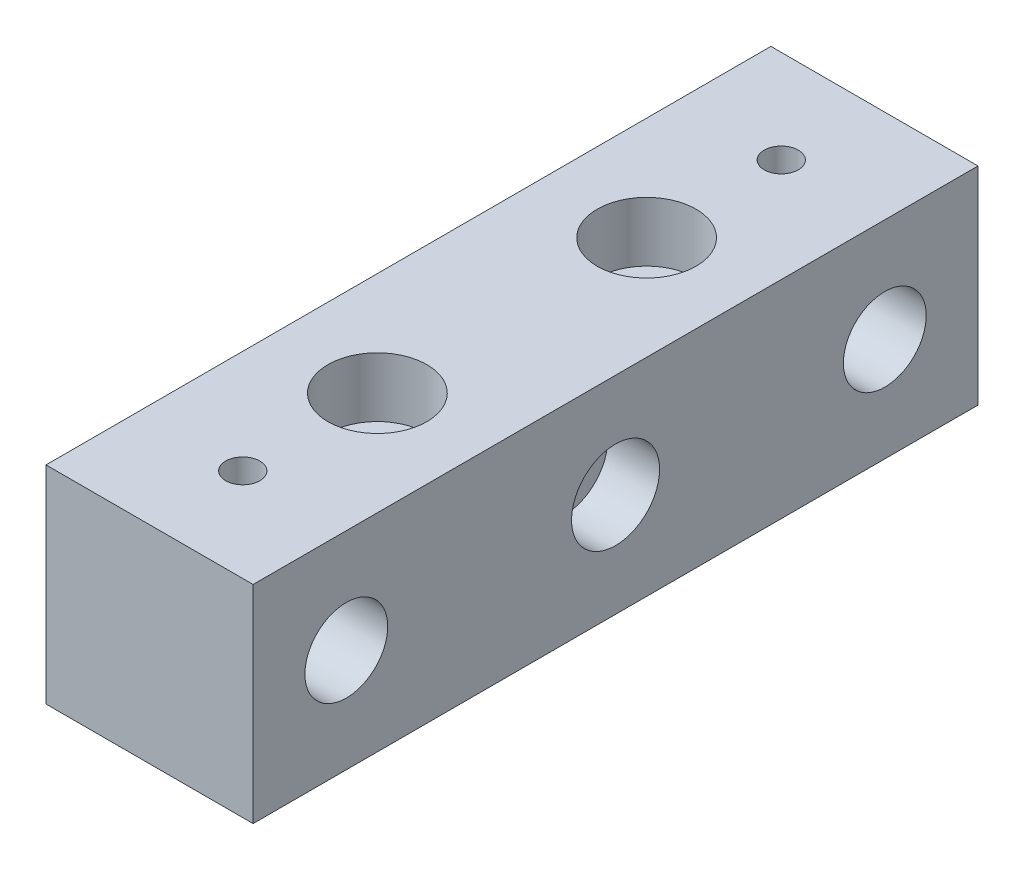
ISO-10303-21;
HEADER;
FILE_DESCRIPTION(('STEP AP214'),'2;1');
FILE_NAME('part.step','',(''),(''),'','','');
FILE_SCHEMA(('AUTOMOTIVE_DESIGN { 1 0 10303 214 1 1 1 1 }'));
ENDSEC;
DATA;
#1=APPLICATION_CONTEXT('core data for automotive mechanical design processes');
#2=APPLICATION_PROTOCOL_DEFINITION('international standard','automotive_design',2000,#1);
#3=PRODUCT_CONTEXT('',#1,'mechanical');
#4=PRODUCT('Part','Part','',(#3));
#5=PRODUCT_RELATED_PRODUCT_CATEGORY('part','',(#4));
#6=PRODUCT_DEFINITION_FORMATION('','',#4);
#7=PRODUCT_DEFINITION_CONTEXT('part definition',#1,'design');
#8=PRODUCT_DEFINITION('design','',#6,#7);
#9=PRODUCT_DEFINITION_SHAPE('','',#8);
#10=(LENGTH_UNIT() NAMED_UNIT(*) SI_UNIT(.MILLI.,.METRE.));
#11=(NAMED_UNIT(*) PLANE_ANGLE_UNIT() SI_UNIT($,.RADIAN.));
#12=(NAMED_UNIT(*) SI_UNIT($,.STERADIAN.) SOLID_ANGLE_UNIT());
#13=UNCERTAINTY_MEASURE_WITH_UNIT(LENGTH_MEASURE(1.E-05),#10,'distance_accuracy_value','');
#14=(GEOMETRIC_REPRESENTATION_CONTEXT(3) GLOBAL_UNCERTAINTY_ASSIGNED_CONTEXT((#13)) GLOBAL_UNIT_ASSIGNED_CONTEXT((#10,
#11,#12)) REPRESENTATION_CONTEXT('',''));
#15=CARTESIAN_POINT('',(0.,0.,0.));
#16=DIRECTION('',(0.,0.,1.));
#17=DIRECTION('',(1.,0.,0.));
#18=AXIS2_PLACEMENT_3D('',#15,#16,#17);
#19=CARTESIAN_POINT('',(10.,-20.,35.));
#20=DIRECTION('',(1.,0.,0.));
#21=DIRECTION('',(0.,0.,-1.));
#22=AXIS2_PLACEMENT_3D('',#19,#20,#21);
#23=PLANE('',#22);
#24=CARTESIAN_POINT('',(10.,-10.,-3.81222831080663E-11));
#25=DIRECTION('',(1.,0.,0.));
#26=DIRECTION('',(0.,0.,-1.));
#27=AXIS2_PLACEMENT_3D('',#24,#25,#26);
#28=CIRCLE('',#27,4.25000000000001);
#29=CARTESIAN_POINT('',(10.,-10.,-4.25000000003813));
#30=VERTEX_POINT('',#29);
#31=EDGE_CURVE('E161',#30,#30,#28,.T.);
#32=ORIENTED_EDGE('',*,*,#31,.F.);
#33=EDGE_LOOP('',(#32));
#34=FACE_BOUND('',#33,.T.);
#35=CARTESIAN_POINT('',(10.,-10.,25.9999999999617));
#36=DIRECTION('',(-1.,0.,0.));
#37=DIRECTION('',(0.,0.,1.));
#38=AXIS2_PLACEMENT_3D('',#35,#36,#37);
#39=CIRCLE('',#38,4.);
#40=CARTESIAN_POINT('',(10.,-10.,29.9999999999617));
#41=VERTEX_POINT('',#40);
#42=EDGE_CURVE('E170',#41,#41,#39,.T.);
#43=ORIENTED_EDGE('',*,*,#42,.T.);
#44=EDGE_LOOP('',(#43));
#45=FACE_BOUND('',#44,.T.);
#46=CARTESIAN_POINT('',(10.,-10.,-26.0000000000383));
#47=DIRECTION('',(-1.,0.,0.));
#48=DIRECTION('',(0.,0.,1.));
#49=AXIS2_PLACEMENT_3D('',#46,#47,#48);
#50=CIRCLE('',#49,4.00000000000001);
#51=CARTESIAN_POINT('',(10.,-10.,-22.0000000000383));
#52=VERTEX_POINT('',#51);
#53=EDGE_CURVE('E167',#52,#52,#50,.T.);
#54=ORIENTED_EDGE('',*,*,#53,.T.);
#55=EDGE_LOOP('',(#54));
#56=FACE_BOUND('',#55,.T.);
#57=DIRECTION('',(0.,0.,-1.));
#58=VECTOR('',#57,1.);
#59=CARTESIAN_POINT('',(10.,0.,35.));
#60=LINE('',#59,#58);
#61=CARTESIAN_POINT('',(10.,0.,35.));
#62=VERTEX_POINT('',#61);
#63=CARTESIAN_POINT('',(10.,0.,-35.));
#64=VERTEX_POINT('',#63);
#65=EDGE_CURVE('E114',#62,#64,#60,.T.);
#66=ORIENTED_EDGE('',*,*,#65,.F.);
#67=DIRECTION('',(0.,1.,0.));
#68=VECTOR('',#67,1.);
#69=CARTESIAN_POINT('',(10.,-20.,35.));
#70=LINE('',#69,#68);
#71=CARTESIAN_POINT('',(10.,-20.,35.));
#72=VERTEX_POINT('',#71);
#73=EDGE_CURVE('E11',#72,#62,#70,.T.);
#74=ORIENTED_EDGE('',*,*,#73,.F.);
#75=DIRECTION('',(0.,0.,-1.));
#76=VECTOR('',#75,1.);
#77=CARTESIAN_POINT('',(10.,-20.,35.));
#78=LINE('',#77,#76);
#79=CARTESIAN_POINT('',(10.,-20.,-35.));
#80=VERTEX_POINT('',#79);
#81=EDGE_CURVE('E108',#72,#80,#78,.T.);
#82=ORIENTED_EDGE('',*,*,#81,.T.);
#83=DIRECTION('',(0.,1.,0.));
#84=VECTOR('',#83,1.);
#85=CARTESIAN_POINT('',(10.,-20.,-35.));
#86=LINE('',#85,#84);
#87=EDGE_CURVE('E94',#80,#64,#86,.T.);
#88=ORIENTED_EDGE('',*,*,#87,.T.);
#89=EDGE_LOOP('',(#66,#74,#82,#88));
#90=FACE_BOUND('',#89,.T.);
#91=ADVANCED_FACE('F43',(#34,#45,#56,#90),#23,.T.);
#92=CARTESIAN_POINT('',(-10.,-20.,35.));
#93=DIRECTION('',(0.,0.,1.));
#94=DIRECTION('',(1.,0.,0.));
#95=AXIS2_PLACEMENT_3D('',#92,#93,#94);
#96=PLANE('',#95);
#97=DIRECTION('',(1.,0.,0.));
#98=VECTOR('',#97,1.);
#99=CARTESIAN_POINT('',(-10.,0.,35.));
#100=LINE('',#99,#98);
#101=CARTESIAN_POINT('',(-10.,0.,35.));
#102=VERTEX_POINT('',#101);
#103=EDGE_CURVE('E109',#102,#62,#100,.T.);
#104=ORIENTED_EDGE('',*,*,#103,.F.);
#105=DIRECTION('',(0.,1.,0.));
#106=VECTOR('',#105,1.);
#107=CARTESIAN_POINT('',(-10.,-20.,35.));
#108=LINE('',#107,#106);
#109=CARTESIAN_POINT('',(-10.,-20.,35.));
#110=VERTEX_POINT('',#109);
#111=EDGE_CURVE('E60',#110,#102,#108,.T.);
#112=ORIENTED_EDGE('',*,*,#111,.F.);
#113=DIRECTION('',(1.,0.,0.));
#114=VECTOR('',#113,1.);
#115=CARTESIAN_POINT('',(-10.,-20.,35.));
#116=LINE('',#115,#114);
#117=EDGE_CURVE('E102',#110,#72,#116,.T.);
#118=ORIENTED_EDGE('',*,*,#117,.T.);
#119=ORIENTED_EDGE('',*,*,#73,.T.);
#120=EDGE_LOOP('',(#104,#112,#118,#119));
#121=FACE_BOUND('',#120,.T.);
#122=ADVANCED_FACE('F153',(#121),#96,.T.);
#123=CARTESIAN_POINT('',(-10.,-20.,35.));
#124=DIRECTION('',(-1.,0.,0.));
#125=DIRECTION('',(0.,0.,1.));
#126=AXIS2_PLACEMENT_3D('',#123,#124,#125);
#127=PLANE('',#126);
#128=CARTESIAN_POINT('',(-10.,-10.,25.9999999999617));
#129=DIRECTION('',(-1.,0.,0.));
#130=DIRECTION('',(0.,0.,1.));
#131=AXIS2_PLACEMENT_3D('',#128,#129,#130);
#132=CIRCLE('',#131,4.);
#133=CARTESIAN_POINT('',(-10.,-10.,29.9999999999617));
#134=VERTEX_POINT('',#133);
#135=EDGE_CURVE('E340',#134,#134,#132,.T.);
#136=ORIENTED_EDGE('',*,*,#135,.F.);
#137=EDGE_LOOP('',(#136));
#138=FACE_BOUND('',#137,.T.);
#139=CARTESIAN_POINT('',(-10.,-10.,-26.0000000000383));
#140=DIRECTION('',(-1.,0.,0.));
#141=DIRECTION('',(0.,0.,1.));
#142=AXIS2_PLACEMENT_3D('',#139,#140,#141);
#143=CIRCLE('',#142,4.00000000000001);
#144=CARTESIAN_POINT('',(-10.,-10.,-22.0000000000383));
#145=VERTEX_POINT('',#144);
#146=EDGE_CURVE('E338',#145,#145,#143,.T.);
#147=ORIENTED_EDGE('',*,*,#146,.F.);
#148=EDGE_LOOP('',(#147));
#149=FACE_BOUND('',#148,.T.);
#150=DIRECTION('',(0.,0.,1.));
#151=VECTOR('',#150,1.);
#152=CARTESIAN_POINT('',(-10.,0.,35.));
#153=LINE('',#152,#151);
#154=CARTESIAN_POINT('',(-10.,0.,-35.));
#155=VERTEX_POINT('',#154);
#156=EDGE_CURVE('E100',#155,#102,#153,.T.);
#157=ORIENTED_EDGE('',*,*,#156,.F.);
#158=DIRECTION('',(0.,1.,0.));
#159=VECTOR('',#158,1.);
#160=CARTESIAN_POINT('',(-10.,-20.,-35.));
#161=LINE('',#160,#159);
#162=CARTESIAN_POINT('',(-10.,-20.,-35.));
#163=VERTEX_POINT('',#162);
#164=EDGE_CURVE('E93',#163,#155,#161,.T.);
#165=ORIENTED_EDGE('',*,*,#164,.F.);
#166=DIRECTION('',(0.,0.,1.));
#167=VECTOR('',#166,1.);
#168=CARTESIAN_POINT('',(-10.,-20.,35.));
#169=LINE('',#168,#167);
#170=EDGE_CURVE('E97',#163,#110,#169,.T.);
#171=ORIENTED_EDGE('',*,*,#170,.T.);
#172=ORIENTED_EDGE('',*,*,#111,.T.);
#173=EDGE_LOOP('',(#157,#165,#171,#172));
#174=FACE_BOUND('',#173,.T.);
#175=ADVANCED_FACE('F98',(#138,#149,#174),#127,.T.);
#176=CARTESIAN_POINT('',(-10.,-20.,-35.));
#177=DIRECTION('',(0.,0.,-1.));
#178=DIRECTION('',(-1.,0.,0.));
#179=AXIS2_PLACEMENT_3D('',#176,#177,#178);
#180=PLANE('',#179);
#181=DIRECTION('',(-1.,0.,0.));
#182=VECTOR('',#181,1.);
#183=CARTESIAN_POINT('',(-10.,0.,-35.));
#184=LINE('',#183,#182);
#185=EDGE_CURVE('E117',#64,#155,#184,.T.);
#186=ORIENTED_EDGE('',*,*,#185,.F.);
#187=ORIENTED_EDGE('',*,*,#87,.F.);
#188=DIRECTION('',(-1.,0.,0.));
#189=VECTOR('',#188,1.);
#190=CARTESIAN_POINT('',(-10.,-20.,-35.));
#191=LINE('',#190,#189);
#192=EDGE_CURVE('E104',#80,#163,#191,.T.);
#193=ORIENTED_EDGE('',*,*,#192,.T.);
#194=ORIENTED_EDGE('',*,*,#164,.T.);
#195=EDGE_LOOP('',(#186,#187,#193,#194));
#196=FACE_BOUND('',#195,.T.);
#197=ADVANCED_FACE('F110',(#196),#180,.T.);
#198=CARTESIAN_POINT('',(0.,-20.,0.));
#199=DIRECTION('',(0.,-1.,0.));
#200=DIRECTION('',(0.,0.,-1.));
#201=AXIS2_PLACEMENT_3D('',#198,#199,#200);
#202=PLANE('',#201);
#203=CARTESIAN_POINT('',(0.,-20.,-13.));
#204=DIRECTION('',(0.,1.,0.));
#205=DIRECTION('',(0.,0.,1.));
#206=AXIS2_PLACEMENT_3D('',#203,#204,#205);
#207=CIRCLE('',#206,2.65);
#208=CARTESIAN_POINT('',(0.,-20.,-10.35));
#209=VERTEX_POINT('',#208);
#210=EDGE_CURVE('E343',#209,#209,#207,.T.);
#211=ORIENTED_EDGE('',*,*,#210,.T.);
#212=EDGE_LOOP('',(#211));
#213=FACE_BOUND('',#212,.T.);
#214=CARTESIAN_POINT('',(0.,-20.,13.));
#215=DIRECTION('',(0.,1.,0.));
#216=DIRECTION('',(0.,0.,1.));
#217=AXIS2_PLACEMENT_3D('',#214,#215,#216);
#218=CIRCLE('',#217,2.65);
#219=CARTESIAN_POINT('',(0.,-20.,15.65));
#220=VERTEX_POINT('',#219);
#221=EDGE_CURVE('E337',#220,#220,#218,.T.);
#222=ORIENTED_EDGE('',*,*,#221,.T.);
#223=EDGE_LOOP('',(#222));
#224=FACE_BOUND('',#223,.T.);
#225=ORIENTED_EDGE('',*,*,#81,.F.);
#226=ORIENTED_EDGE('',*,*,#117,.F.);
#227=ORIENTED_EDGE('',*,*,#170,.F.);
#228=ORIENTED_EDGE('',*,*,#192,.F.);
#229=EDGE_LOOP('',(#225,#226,#227,#228));
#230=FACE_BOUND('',#229,.T.);
#231=ADVANCED_FACE('F101',(#213,#224,#230),#202,.T.);
#232=CARTESIAN_POINT('',(0.,0.,0.));
#233=DIRECTION('',(0.,-1.,0.));
#234=DIRECTION('',(0.,0.,-1.));
#235=AXIS2_PLACEMENT_3D('',#232,#233,#234);
#236=PLANE('',#235);
#237=CARTESIAN_POINT('',(0.,0.,25.9999999999617));
#238=DIRECTION('',(0.,1.,0.));
#239=DIRECTION('',(0.,0.,1.));
#240=AXIS2_PLACEMENT_3D('',#237,#238,#239);
#241=CIRCLE('',#240,1.6499999999887);
#242=CARTESIAN_POINT('',(0.,0.,27.6499999999504));
#243=VERTEX_POINT('',#242);
#244=EDGE_CURVE('E131',#243,#243,#241,.T.);
#245=ORIENTED_EDGE('',*,*,#244,.F.);
#246=EDGE_LOOP('',(#245));
#247=FACE_BOUND('',#246,.T.);
#248=CARTESIAN_POINT('',(0.,0.,-26.0000000000383));
#249=DIRECTION('',(0.,1.,0.));
#250=DIRECTION('',(0.,0.,1.));
#251=AXIS2_PLACEMENT_3D('',#248,#249,#250);
#252=CIRCLE('',#251,1.6499999999887);
#253=CARTESIAN_POINT('',(0.,0.,-24.3500000000496));
#254=VERTEX_POINT('',#253);
#255=EDGE_CURVE('E330',#254,#254,#252,.T.);
#256=ORIENTED_EDGE('',*,*,#255,.F.);
#257=EDGE_LOOP('',(#256));
#258=FACE_BOUND('',#257,.T.);
#259=CARTESIAN_POINT('',(0.,0.,13.));
#260=DIRECTION('',(0.,1.,0.));
#261=DIRECTION('',(0.,0.,1.));
#262=AXIS2_PLACEMENT_3D('',#259,#260,#261);
#263=CIRCLE('',#262,4.775);
#264=CARTESIAN_POINT('',(0.,0.,17.775));
#265=VERTEX_POINT('',#264);
#266=EDGE_CURVE('E356',#265,#265,#263,.T.);
#267=ORIENTED_EDGE('',*,*,#266,.F.);
#268=EDGE_LOOP('',(#267));
#269=FACE_BOUND('',#268,.T.);
#270=CARTESIAN_POINT('',(0.,0.,-13.));
#271=DIRECTION('',(0.,1.,0.));
#272=DIRECTION('',(0.,0.,1.));
#273=AXIS2_PLACEMENT_3D('',#270,#271,#272);
#274=CIRCLE('',#273,4.775);
#275=CARTESIAN_POINT('',(0.,0.,-8.225));
#276=VERTEX_POINT('',#275);
#277=EDGE_CURVE('E363',#276,#276,#274,.T.);
#278=ORIENTED_EDGE('',*,*,#277,.F.);
#279=EDGE_LOOP('',(#278));
#280=FACE_BOUND('',#279,.T.);
#281=ORIENTED_EDGE('',*,*,#65,.T.);
#282=ORIENTED_EDGE('',*,*,#185,.T.);
#283=ORIENTED_EDGE('',*,*,#156,.T.);
#284=ORIENTED_EDGE('',*,*,#103,.T.);
#285=EDGE_LOOP('',(#281,#282,#283,#284));
#286=FACE_BOUND('',#285,.T.);
#287=ADVANCED_FACE('F175',(#247,#258,#269,#280,#286),#236,.F.);
#288=CARTESIAN_POINT('',(0.,-5.75,-13.));
#289=DIRECTION('',(0.,1.,0.));
#290=DIRECTION('',(0.,0.,1.));
#291=AXIS2_PLACEMENT_3D('',#288,#289,#290);
#292=CYLINDRICAL_SURFACE('',#291,4.775);
#293=CARTESIAN_POINT('',(0.,-5.75,-13.));
#294=DIRECTION('',(0.,1.,0.));
#295=DIRECTION('',(0.,0.,1.));
#296=AXIS2_PLACEMENT_3D('',#293,#294,#295);
#297=CIRCLE('',#296,4.775);
#298=CARTESIAN_POINT('',(0.,-5.75,-8.225));
#299=VERTEX_POINT('',#298);
#300=EDGE_CURVE('E346',#299,#299,#297,.T.);
#301=ORIENTED_EDGE('',*,*,#300,.F.);
#302=EDGE_LOOP('',(#301));
#303=FACE_BOUND('',#302,.T.);
#304=ORIENTED_EDGE('',*,*,#277,.T.);
#305=EDGE_LOOP('',(#304));
#306=FACE_BOUND('',#305,.T.);
#307=ADVANCED_FACE('F172',(#303,#306),#292,.F.);
#308=CARTESIAN_POINT('',(0.,-5.75,-13.));
#309=DIRECTION('',(0.,1.,0.));
#310=DIRECTION('',(0.,0.,1.));
#311=AXIS2_PLACEMENT_3D('',#308,#309,#310);
#312=PLANE('',#311);
#313=CARTESIAN_POINT('',(0.,-5.75,-13.));
#314=DIRECTION('',(0.,1.,0.));
#315=DIRECTION('',(0.,0.,1.));
#316=AXIS2_PLACEMENT_3D('',#313,#314,#315);
#317=CIRCLE('',#316,2.65);
#318=CARTESIAN_POINT('',(0.,-5.75,-10.35));
#319=VERTEX_POINT('',#318);
#320=EDGE_CURVE('E350',#319,#319,#317,.T.);
#321=ORIENTED_EDGE('',*,*,#320,.F.);
#322=EDGE_LOOP('',(#321));
#323=FACE_BOUND('',#322,.T.);
#324=ORIENTED_EDGE('',*,*,#300,.T.);
#325=EDGE_LOOP('',(#324));
#326=FACE_BOUND('',#325,.T.);
#327=ADVANCED_FACE('F185',(#323,#326),#312,.T.);
#328=CARTESIAN_POINT('',(0.,-5.75,13.));
#329=DIRECTION('',(0.,1.,0.));
#330=DIRECTION('',(0.,0.,1.));
#331=AXIS2_PLACEMENT_3D('',#328,#329,#330);
#332=CYLINDRICAL_SURFACE('',#331,4.775);
#333=CARTESIAN_POINT('',(0.,-5.75,13.));
#334=DIRECTION('',(0.,1.,0.));
#335=DIRECTION('',(0.,0.,1.));
#336=AXIS2_PLACEMENT_3D('',#333,#334,#335);
#337=CIRCLE('',#336,4.775);
#338=CARTESIAN_POINT('',(0.,-5.75,17.775));
#339=VERTEX_POINT('',#338);
#340=EDGE_CURVE('E118',#339,#339,#337,.T.);
#341=ORIENTED_EDGE('',*,*,#340,.F.);
#342=EDGE_LOOP('',(#341));
#343=FACE_BOUND('',#342,.T.);
#344=ORIENTED_EDGE('',*,*,#266,.T.);
#345=EDGE_LOOP('',(#344));
#346=FACE_BOUND('',#345,.T.);
#347=ADVANCED_FACE('F208',(#343,#346),#332,.F.);
#348=CARTESIAN_POINT('',(0.,-5.75,13.));
#349=DIRECTION('',(0.,1.,0.));
#350=DIRECTION('',(0.,0.,1.));
#351=AXIS2_PLACEMENT_3D('',#348,#349,#350);
#352=PLANE('',#351);
#353=CARTESIAN_POINT('',(0.,-5.75,13.));
#354=DIRECTION('',(0.,1.,0.));
#355=DIRECTION('',(0.,0.,1.));
#356=AXIS2_PLACEMENT_3D('',#353,#354,#355);
#357=CIRCLE('',#356,2.65);
#358=CARTESIAN_POINT('',(0.,-5.75,15.65));
#359=VERTEX_POINT('',#358);
#360=EDGE_CURVE('E354',#359,#359,#357,.T.);
#361=ORIENTED_EDGE('',*,*,#360,.F.);
#362=EDGE_LOOP('',(#361));
#363=FACE_BOUND('',#362,.T.);
#364=ORIENTED_EDGE('',*,*,#340,.T.);
#365=EDGE_LOOP('',(#364));
#366=FACE_BOUND('',#365,.T.);
#367=ADVANCED_FACE('F215',(#363,#366),#352,.T.);
#368=CARTESIAN_POINT('',(0.,-20.,13.));
#369=DIRECTION('',(0.,1.,0.));
#370=DIRECTION('',(0.,0.,1.));
#371=AXIS2_PLACEMENT_3D('',#368,#369,#370);
#372=CYLINDRICAL_SURFACE('',#371,2.65);
#373=CARTESIAN_POINT('',(0.,-20.,15.65));
#374=CARTESIAN_POINT('',(0.,-19.8515625,15.65));
#375=CARTESIAN_POINT('',(0.,-19.703125,15.65));
#376=CARTESIAN_POINT('',(0.,-19.40625,15.65));
#377=CARTESIAN_POINT('',(0.,-19.2578125,15.65));
#378=CARTESIAN_POINT('',(0.,-18.9609375,15.65));
#379=CARTESIAN_POINT('',(0.,-18.8125,15.65));
#380=CARTESIAN_POINT('',(0.,-18.515625,15.65));
#381=CARTESIAN_POINT('',(0.,-18.3671875,15.65));
#382=CARTESIAN_POINT('',(0.,-18.0703125,15.65));
#383=CARTESIAN_POINT('',(0.,-17.921875,15.65));
#384=CARTESIAN_POINT('',(0.,-17.625,15.65));
#385=CARTESIAN_POINT('',(0.,-17.4765625,15.65));
#386=CARTESIAN_POINT('',(0.,-17.1796875,15.65));
#387=CARTESIAN_POINT('',(0.,-17.03125,15.65));
#388=CARTESIAN_POINT('',(0.,-16.734375,15.65));
#389=CARTESIAN_POINT('',(0.,-16.5859375,15.65));
#390=CARTESIAN_POINT('',(0.,-16.2890625,15.65));
#391=CARTESIAN_POINT('',(0.,-16.140625,15.65));
#392=CARTESIAN_POINT('',(0.,-15.84375,15.65));
#393=CARTESIAN_POINT('',(0.,-15.6953125,15.65));
#394=CARTESIAN_POINT('',(0.,-15.3984375,15.65));
#395=CARTESIAN_POINT('',(0.,-15.25,15.65));
#396=CARTESIAN_POINT('',(0.,-14.953125,15.65));
#397=CARTESIAN_POINT('',(0.,-14.8046875,15.65));
#398=CARTESIAN_POINT('',(0.,-14.5078125,15.65));
#399=CARTESIAN_POINT('',(0.,-14.359375,15.65));
#400=CARTESIAN_POINT('',(0.,-14.0625,15.65));
#401=CARTESIAN_POINT('',(0.,-13.9140625,15.65));
#402=CARTESIAN_POINT('',(0.,-13.6171875,15.65));
#403=CARTESIAN_POINT('',(0.,-13.46875,15.65));
#404=CARTESIAN_POINT('',(0.,-13.171875,15.65));
#405=CARTESIAN_POINT('',(0.,-13.0234375,15.65));
#406=CARTESIAN_POINT('',(0.,-12.7265625,15.65));
#407=CARTESIAN_POINT('',(0.,-12.578125,15.65));
#408=CARTESIAN_POINT('',(0.,-12.28125,15.65));
#409=CARTESIAN_POINT('',(0.,-12.1328125,15.65));
#410=CARTESIAN_POINT('',(0.,-11.8359375,15.65));
#411=CARTESIAN_POINT('',(0.,-11.6875,15.65));
#412=CARTESIAN_POINT('',(0.,-11.390625,15.65));
#413=CARTESIAN_POINT('',(0.,-11.2421875,15.65));
#414=CARTESIAN_POINT('',(0.,-10.9453125,15.65));
#415=CARTESIAN_POINT('',(0.,-10.796875,15.65));
#416=CARTESIAN_POINT('',(0.,-10.5,15.65));
#417=CARTESIAN_POINT('',(0.,-10.3515625,15.65));
#418=CARTESIAN_POINT('',(0.,-10.0546875,15.65));
#419=CARTESIAN_POINT('',(0.,-9.90625,15.65));
#420=CARTESIAN_POINT('',(0.,-9.609375,15.65));
#421=CARTESIAN_POINT('',(0.,-9.4609375,15.65));
#422=CARTESIAN_POINT('',(0.,-9.1640625,15.65));
#423=CARTESIAN_POINT('',(0.,-9.015625,15.65));
#424=CARTESIAN_POINT('',(0.,-8.71875,15.65));
#425=CARTESIAN_POINT('',(0.,-8.5703125,15.65));
#426=CARTESIAN_POINT('',(0.,-8.2734375,15.65));
#427=CARTESIAN_POINT('',(0.,-8.125,15.65));
#428=CARTESIAN_POINT('',(0.,-7.828125,15.65));
#429=CARTESIAN_POINT('',(0.,-7.6796875,15.65));
#430=CARTESIAN_POINT('',(0.,-7.3828125,15.65));
#431=CARTESIAN_POINT('',(0.,-7.234375,15.65));
#432=CARTESIAN_POINT('',(0.,-6.9375,15.65));
#433=CARTESIAN_POINT('',(0.,-6.7890625,15.65));
#434=CARTESIAN_POINT('',(0.,-6.4921875,15.65));
#435=CARTESIAN_POINT('',(0.,-6.34375,15.65));
#436=CARTESIAN_POINT('',(0.,-6.046875,15.65));
#437=CARTESIAN_POINT('',(0.,-5.8984375,15.65));
#438=CARTESIAN_POINT('',(0.,-5.75,15.65));
#439=B_SPLINE_CURVE_WITH_KNOTS('',3,(#373,#374,#375,#376,#377,#378,#379,#380,#381,#382,#383,
#384,#385,#386,#387,#388,#389,#390,#391,#392,#393,#394,#395,#396,#397,#398,#399,#400,#401,#402,
#403,#404,#405,#406,#407,#408,#409,#410,#411,#412,#413,#414,#415,#416,#417,#418,#419,#420,#421,
#422,#423,#424,#425,#426,#427,#428,#429,#430,#431,#432,#433,#434,#435,#436,#437,#438),
.UNSPECIFIED.,.F.,.F.,(4,2,2,2,2,2,2,2,2,2,2,2,2,2,2,2,2,2,2,2,2,2,2,2,2,2,2,2,2,2,2,2,4),(0.,
0.445312500000003,0.890625000000003,1.3359375,1.78125,2.2265625,2.671875,3.1171875,3.5625,
4.0078125,4.453125,4.8984375,5.34375,5.7890625,6.234375,6.6796875,7.125,7.5703125,8.015625,
8.4609375,8.90625,9.3515625,9.796875,10.2421875,10.6875,11.1328125,11.578125,12.0234375,
12.46875,12.9140625,13.359375,13.8046875,14.25),.UNSPECIFIED.);
#440=EDGE_CURVE('BSEAM231',#220,#359,#439,.T.);
#441=ORIENTED_EDGE('',*,*,#221,.F.);
#442=ORIENTED_EDGE('',*,*,#360,.T.);
#443=ORIENTED_EDGE('',*,*,#440,.T.);
#444=ORIENTED_EDGE('',*,*,#440,.F.);
#445=EDGE_LOOP('',(#441,#443,#442,#444));
#446=FACE_BOUND('',#445,.T.);
#447=ADVANCED_FACE('F231',(#446),#372,.F.);
#448=CARTESIAN_POINT('',(0.,-20.,-13.));
#449=DIRECTION('',(0.,1.,0.));
#450=DIRECTION('',(0.,0.,1.));
#451=AXIS2_PLACEMENT_3D('',#448,#449,#450);
#452=CYLINDRICAL_SURFACE('',#451,2.65);
#453=CARTESIAN_POINT('',(0.,-20.,-10.35));
#454=CARTESIAN_POINT('',(0.,-19.8515625,-10.35));
#455=CARTESIAN_POINT('',(0.,-19.703125,-10.35));
#456=CARTESIAN_POINT('',(0.,-19.40625,-10.35));
#457=CARTESIAN_POINT('',(0.,-19.2578125,-10.35));
#458=CARTESIAN_POINT('',(0.,-18.9609375,-10.35));
#459=CARTESIAN_POINT('',(0.,-18.8125,-10.35));
#460=CARTESIAN_POINT('',(0.,-18.515625,-10.35));
#461=CARTESIAN_POINT('',(0.,-18.3671875,-10.35));
#462=CARTESIAN_POINT('',(0.,-18.0703125,-10.35));
#463=CARTESIAN_POINT('',(0.,-17.921875,-10.35));
#464=CARTESIAN_POINT('',(0.,-17.625,-10.35));
#465=CARTESIAN_POINT('',(0.,-17.4765625,-10.35));
#466=CARTESIAN_POINT('',(0.,-17.1796875,-10.35));
#467=CARTESIAN_POINT('',(0.,-17.03125,-10.35));
#468=CARTESIAN_POINT('',(0.,-16.734375,-10.35));
#469=CARTESIAN_POINT('',(0.,-16.5859375,-10.35));
#470=CARTESIAN_POINT('',(0.,-16.2890625,-10.35));
#471=CARTESIAN_POINT('',(0.,-16.140625,-10.35));
#472=CARTESIAN_POINT('',(0.,-15.84375,-10.35));
#473=CARTESIAN_POINT('',(0.,-15.6953125,-10.35));
#474=CARTESIAN_POINT('',(0.,-15.3984375,-10.35));
#475=CARTESIAN_POINT('',(0.,-15.25,-10.35));
#476=CARTESIAN_POINT('',(0.,-14.953125,-10.35));
#477=CARTESIAN_POINT('',(0.,-14.8046875,-10.35));
#478=CARTESIAN_POINT('',(0.,-14.5078125,-10.35));
#479=CARTESIAN_POINT('',(0.,-14.359375,-10.35));
#480=CARTESIAN_POINT('',(0.,-14.0625,-10.35));
#481=CARTESIAN_POINT('',(0.,-13.9140625,-10.35));
#482=CARTESIAN_POINT('',(0.,-13.6171875,-10.35));
#483=CARTESIAN_POINT('',(0.,-13.46875,-10.35));
#484=CARTESIAN_POINT('',(0.,-13.171875,-10.35));
#485=CARTESIAN_POINT('',(0.,-13.0234375,-10.35));
#486=CARTESIAN_POINT('',(0.,-12.7265625,-10.35));
#487=CARTESIAN_POINT('',(0.,-12.578125,-10.35));
#488=CARTESIAN_POINT('',(0.,-12.28125,-10.35));
#489=CARTESIAN_POINT('',(0.,-12.1328125,-10.35));
#490=CARTESIAN_POINT('',(0.,-11.8359375,-10.35));
#491=CARTESIAN_POINT('',(0.,-11.6875,-10.35));
#492=CARTESIAN_POINT('',(0.,-11.390625,-10.35));
#493=CARTESIAN_POINT('',(0.,-11.2421875,-10.35));
#494=CARTESIAN_POINT('',(0.,-10.9453125,-10.35));
#495=CARTESIAN_POINT('',(0.,-10.796875,-10.35));
#496=CARTESIAN_POINT('',(0.,-10.5,-10.35));
#497=CARTESIAN_POINT('',(0.,-10.3515625,-10.35));
#498=CARTESIAN_POINT('',(0.,-10.0546875,-10.35));
#499=CARTESIAN_POINT('',(0.,-9.90625,-10.35));
#500=CARTESIAN_POINT('',(0.,-9.609375,-10.35));
#501=CARTESIAN_POINT('',(0.,-9.4609375,-10.35));
#502=CARTESIAN_POINT('',(0.,-9.1640625,-10.35));
#503=CARTESIAN_POINT('',(0.,-9.015625,-10.35));
#504=CARTESIAN_POINT('',(0.,-8.71875,-10.35));
#505=CARTESIAN_POINT('',(0.,-8.5703125,-10.35));
#506=CARTESIAN_POINT('',(0.,-8.2734375,-10.35));
#507=CARTESIAN_POINT('',(0.,-8.125,-10.35));
#508=CARTESIAN_POINT('',(0.,-7.828125,-10.35));
#509=CARTESIAN_POINT('',(0.,-7.6796875,-10.35));
#510=CARTESIAN_POINT('',(0.,-7.3828125,-10.35));
#511=CARTESIAN_POINT('',(0.,-7.234375,-10.35));
#512=CARTESIAN_POINT('',(0.,-6.9375,-10.35));
#513=CARTESIAN_POINT('',(0.,-6.7890625,-10.35));
#514=CARTESIAN_POINT('',(0.,-6.4921875,-10.35));
#515=CARTESIAN_POINT('',(0.,-6.34375,-10.35));
#516=CARTESIAN_POINT('',(0.,-6.046875,-10.35));
#517=CARTESIAN_POINT('',(0.,-5.8984375,-10.35));
#518=CARTESIAN_POINT('',(0.,-5.75,-10.35));
#519=B_SPLINE_CURVE_WITH_KNOTS('',3,(#453,#454,#455,#456,#457,#458,#459,#460,#461,#462,#463,
#464,#465,#466,#467,#468,#469,#470,#471,#472,#473,#474,#475,#476,#477,#478,#479,#480,#481,#482,
#483,#484,#485,#486,#487,#488,#489,#490,#491,#492,#493,#494,#495,#496,#497,#498,#499,#500,#501,
#502,#503,#504,#505,#506,#507,#508,#509,#510,#511,#512,#513,#514,#515,#516,#517,#518),
.UNSPECIFIED.,.F.,.F.,(4,2,2,2,2,2,2,2,2,2,2,2,2,2,2,2,2,2,2,2,2,2,2,2,2,2,2,2,2,2,2,2,4),(0.,
0.445312500000003,0.890625000000003,1.3359375,1.78125,2.2265625,2.671875,3.1171875,3.5625,
4.0078125,4.453125,4.8984375,5.34375,5.7890625,6.234375,6.6796875,7.125,7.5703125,8.015625,
8.4609375,8.90625,9.3515625,9.796875,10.2421875,10.6875,11.1328125,11.578125,12.0234375,
12.46875,12.9140625,13.359375,13.8046875,14.25),.UNSPECIFIED.);
#520=EDGE_CURVE('BSEAM245',#209,#319,#519,.T.);
#521=ORIENTED_EDGE('',*,*,#210,.F.);
#522=ORIENTED_EDGE('',*,*,#320,.T.);
#523=ORIENTED_EDGE('',*,*,#520,.T.);
#524=ORIENTED_EDGE('',*,*,#520,.F.);
#525=EDGE_LOOP('',(#521,#523,#522,#524));
#526=FACE_BOUND('',#525,.T.);
#527=ADVANCED_FACE('F245',(#526),#452,.F.);
#528=CARTESIAN_POINT('',(10.,-10.,-26.0000000000383));
#529=DIRECTION('',(-1.,0.,0.));
#530=DIRECTION('',(0.,0.,1.));
#531=AXIS2_PLACEMENT_3D('',#528,#529,#530);
#532=CYLINDRICAL_SURFACE('',#531,4.00000000000001);
#533=CARTESIAN_POINT('',(0.,-6.35616959779447,-24.3500000000496));
#534=CARTESIAN_POINT('',(0.0880964802251413,-6.35616054724335,-24.3500094319185));
#535=CARTESIAN_POINT('',(0.17634043197251,-6.35292826731919,-24.357100108276));
#536=CARTESIAN_POINT('',(0.350287061076733,-6.34040790874821,-24.3851915445856));
#537=CARTESIAN_POINT('',(0.435982100594934,-6.33110323703648,-24.4062304210859));
#538=CARTESIAN_POINT('',(0.602002938126958,-6.30768674947428,-24.4612646375526));
#539=CARTESIAN_POINT('',(0.682348820214439,-6.2935942883856,-24.4952078760471));
#540=CARTESIAN_POINT('',(0.836181766829133,-6.26221769947257,-24.5749346441063));
#541=CARTESIAN_POINT('',(0.909670542778495,-6.24493437126164,-24.6207152084522));
#542=CARTESIAN_POINT('',(1.05222868784002,-6.20794469581137,-24.7258014371439));
#543=CARTESIAN_POINT('',(1.12082925577325,-6.18815722294935,-24.7857148176337));
#544=CARTESIAN_POINT('',(1.2473547719009,-6.14905636581532,-24.9160892783916));
#545=CARTESIAN_POINT('',(1.30527565146394,-6.129743164645,-24.9865543600824));
#546=CARTESIAN_POINT('',(1.41117137129275,-6.09278424963909,-25.1396980564517));
#547=CARTESIAN_POINT('',(1.45862093269665,-6.0752438329663,-25.2227676099309));
#548=CARTESIAN_POINT('',(1.53867014531151,-6.04479716882126,-25.3965636381674));
#549=CARTESIAN_POINT('',(1.57127626433607,-6.03188890347672,-25.4872867575296));
#550=CARTESIAN_POINT('',(1.61902070664531,-6.01273596621199,-25.668894827737));
#551=CARTESIAN_POINT('',(1.63496684791216,-6.00618435662377,-25.7595343748563));
#552=CARTESIAN_POINT('',(1.65154665184389,-5.99936938438879,-25.9424236448897));
#553=CARTESIAN_POINT('',(1.65218639531068,-5.9991035245907,-26.0346727138098));
#554=CARTESIAN_POINT('',(1.63856350385207,-6.00470775839366,-26.2122973809337));
#555=CARTESIAN_POINT('',(1.6251878162716,-6.01021266615334,-26.2977546654376));
#556=CARTESIAN_POINT('',(1.58543118254106,-6.02624073974032,-26.4650858452715));
#557=CARTESIAN_POINT('',(1.55904927869824,-6.03676427510469,-26.5469594762412));
#558=CARTESIAN_POINT('',(1.49371233826899,-6.06201092268334,-26.7062956068519));
#559=CARTESIAN_POINT('',(1.45457201006446,-6.07679552783557,-26.7836719797967));
#560=CARTESIAN_POINT('',(1.36500872080311,-6.10911236239108,-26.9309604900258));
#561=CARTESIAN_POINT('',(1.31458179948662,-6.12664555557523,-27.0008699945722));
#562=CARTESIAN_POINT('',(1.19981176096184,-6.16412866359784,-27.1363853095023));
#563=CARTESIAN_POINT('',(1.13474658909209,-6.18416185456693,-27.2013574632178));
#564=CARTESIAN_POINT('',(0.994590333670002,-6.22346857215172,-27.3197383842654));
#565=CARTESIAN_POINT('',(0.91949555072869,-6.24274181504926,-27.373142865752));
#566=CARTESIAN_POINT('',(0.758401596445659,-6.27893392842731,-27.4684533984774));
#567=CARTESIAN_POINT('',(0.6721324283009,-6.29575892017054,-27.5099417931215));
#568=CARTESIAN_POINT('',(0.492953328588888,-6.32403614993075,-27.577545081299));
#569=CARTESIAN_POINT('',(0.400048086121625,-6.33549213928121,-27.6036707120889));
#570=CARTESIAN_POINT('',(0.216577104811727,-6.35080908288088,-27.6382132035867));
#571=CARTESIAN_POINT('',(0.12624169881446,-6.35510888827664,-27.6476556945739));
#572=CARTESIAN_POINT('',(-0.0548056297000405,-6.35688019618517,-27.6515710167552));
#573=CARTESIAN_POINT('',(-0.145517416060095,-6.35435398392034,-27.6460488578309));
#574=CARTESIAN_POINT('',(-0.318801009049176,-6.3432105563333,-27.6211271050451));
#575=CARTESIAN_POINT('',(-0.401528179673833,-6.33498196137833,-27.6026120212122));
#576=CARTESIAN_POINT('',(-0.562637064378249,-6.31385387082812,-27.553395802647));
#577=CARTESIAN_POINT('',(-0.641017771349466,-6.30095329787176,-27.5226918569982));
#578=CARTESIAN_POINT('',(-0.794879005692479,-6.27127522141383,-27.448539022077));
#579=CARTESIAN_POINT('',(-0.870100194775593,-6.25435785948641,-27.4046097931099));
#580=CARTESIAN_POINT('',(-1.01246016942512,-6.21875476809765,-27.305734554122));
#581=CARTESIAN_POINT('',(-1.07959548773004,-6.20006828611978,-27.2507838447646));
#582=CARTESIAN_POINT('',(-1.2094296264406,-6.16123988329052,-27.1262754216492));
#583=CARTESIAN_POINT('',(-1.27135173704205,-6.14110032782112,-27.0559038712956));
#584=CARTESIAN_POINT('',(-1.38264285565436,-6.103018851951,-26.9052979801095));
#585=CARTESIAN_POINT('',(-1.432011051995,-6.08507707368586,-26.8250630020567));
#586=CARTESIAN_POINT('',(-1.51670413419767,-6.05331232607991,-26.6565168169141));
#587=CARTESIAN_POINT('',(-1.55200347499318,-6.03949686024839,-26.5681912739019));
#588=CARTESIAN_POINT('',(-1.60699165684845,-6.01762895878925,-26.3861408336378));
#589=CARTESIAN_POINT('',(-1.62668958292832,-6.00957316945155,-26.2924191128509));
#590=CARTESIAN_POINT('',(-1.64878822890939,-6.00051107005531,-26.1091871895794));
#591=CARTESIAN_POINT('',(-1.65228482873066,-5.9990582657525,-26.0198303081538));
#592=CARTESIAN_POINT('',(-1.64481456561817,-6.0021377976057,-25.841838260841));
#593=CARTESIAN_POINT('',(-1.63385014999291,-6.00666912103861,-25.7532029753885));
#594=CARTESIAN_POINT('',(-1.59855535785271,-6.02097585163602,-25.5822946241023));
#595=CARTESIAN_POINT('',(-1.57469555787371,-6.03056636077983,-25.4999076284108));
#596=CARTESIAN_POINT('',(-1.51479588510829,-6.05394519076161,-25.3403326443055));
#597=CARTESIAN_POINT('',(-1.47875367520165,-6.06773431702801,-25.2631456568915));
#598=CARTESIAN_POINT('',(-1.39369547330212,-6.09894191516173,-25.1123388663087));
#599=CARTESIAN_POINT('',(-1.3441687432157,-6.11649576088223,-25.0390357856807));
#600=CARTESIAN_POINT('',(-1.23429715319894,-6.1531429033325,-24.9014706783358));
#601=CARTESIAN_POINT('',(-1.17394837690832,-6.17223675599013,-24.8372119397269));
#602=CARTESIAN_POINT('',(-1.03941247263499,-6.21140258804053,-24.715122300594));
#603=CARTESIAN_POINT('',(-0.964572243105062,-6.23145524792188,-24.6580023205735));
#604=CARTESIAN_POINT('',(-0.805734024309728,-6.26894580799164,-24.5570352532728));
#605=CARTESIAN_POINT('',(-0.721731008281648,-6.28638226032547,-24.5131955019276));
#606=CARTESIAN_POINT('',(-0.547271558722387,-6.31629612094894,-24.440555522381));
#607=CARTESIAN_POINT('',(-0.456860891901791,-6.32880519581545,-24.4116588712957));
#608=CARTESIAN_POINT('',(-0.271952855915827,-6.34718162924384,-24.369827364373));
#609=CARTESIAN_POINT('',(-0.177470309118008,-6.35307126099079,-24.3568389669194));
#610=CARTESIAN_POINT('',(-0.0551366863544196,-6.35585945579712,-24.3506879067553));
#611=CARTESIAN_POINT('',(-0.0275755677135134,-6.35617243075765,-24.349997047728));
#612=CARTESIAN_POINT('',(0.,-6.35616959779447,-24.3500000000496));
#613=B_SPLINE_CURVE_WITH_KNOTS('',3,(#533,#534,#535,#536,#537,#538,#539,#540,#541,#542,#543,
#544,#545,#546,#547,#548,#549,#550,#551,#552,#553,#554,#555,#556,#557,#558,#559,#560,#561,#562,
#563,#564,#565,#566,#567,#568,#569,#570,#571,#572,#573,#574,#575,#576,#577,#578,#579,#580,#581,
#582,#583,#584,#585,#586,#587,#588,#589,#590,#591,#592,#593,#594,#595,#596,#597,#598,#599,#600,
#601,#602,#603,#604,#605,#606,#607,#608,#609,#610,#611,#612),.UNSPECIFIED.,.T.,.F.,(4,2,2,2,2,2,
2,2,2,2,2,2,2,2,2,2,2,2,2,2,2,2,2,2,2,2,2,2,2,2,2,2,2,2,2,2,2,2,2,4),(0.,0.264211724659121,
0.52914845901535,0.793026677867195,1.05683885985109,1.33523297259955,1.61373292675182,
1.90403076093663,2.19420198071236,2.46953816242619,2.74476495899185,3.00356896817772,
3.26239203684643,3.52515526922434,3.78801084537082,4.0690761314541,4.3502453753288,
4.64031806269359,4.93018777237827,5.20152035694793,5.47276211572387,5.72713321022369,
5.98156300024942,6.24665916961614,6.51186861184875,6.79815687279896,7.08446363894211,
7.37128791451301,7.65794504344065,7.92489841520815,8.19180661494492,8.44957452418165,
8.70739191269644,8.9768085234879,9.2463228301924,9.53374725595907,9.82133016529046,
10.1070334851256,10.3917725615402,10.4744749383596),.UNSPECIFIED.);
#614=CARTESIAN_POINT('',(0.,-6.35616959779447,-24.3500000000496));
#615=VERTEX_POINT('',#614);
#616=EDGE_CURVE('E46',#615,#615,#613,.T.);
#617=ORIENTED_EDGE('',*,*,#616,.T.);
#618=EDGE_LOOP('',(#617));
#619=FACE_BOUND('',#618,.T.);
#620=ORIENTED_EDGE('',*,*,#53,.F.);
#621=EDGE_LOOP('',(#620));
#622=FACE_BOUND('',#621,.T.);
#623=ORIENTED_EDGE('',*,*,#146,.T.);
#624=EDGE_LOOP('',(#623));
#625=FACE_BOUND('',#624,.T.);
#626=ADVANCED_FACE('F249',(#619,#622,#625),#532,.F.);
#627=CARTESIAN_POINT('',(10.,-10.,25.9999999999617));
#628=DIRECTION('',(-1.,0.,0.));
#629=DIRECTION('',(0.,0.,1.));
#630=AXIS2_PLACEMENT_3D('',#627,#628,#629);
#631=CYLINDRICAL_SURFACE('',#630,4.);
#632=CARTESIAN_POINT('',(0.,-6.35616959779448,27.6499999999504));
#633=CARTESIAN_POINT('',(0.088096480225141,-6.35616054724336,27.6499905680815));
#634=CARTESIAN_POINT('',(0.17634043197251,-6.3529282673192,27.6428998917241));
#635=CARTESIAN_POINT('',(0.350287061076733,-6.34040790874822,27.6148084554144));
#636=CARTESIAN_POINT('',(0.435982100594934,-6.33110323703648,27.5937695789142));
#637=CARTESIAN_POINT('',(0.602002938126958,-6.30768674947429,27.5387353624474));
#638=CARTESIAN_POINT('',(0.682348820214438,-6.29359428838561,27.504792123953));
#639=CARTESIAN_POINT('',(0.836181766829132,-6.26221769947258,27.4250653558937));
#640=CARTESIAN_POINT('',(0.909670542778495,-6.24493437126165,27.3792847915478));
#641=CARTESIAN_POINT('',(1.05222868784002,-6.20794469581137,27.2741985628561));
#642=CARTESIAN_POINT('',(1.12082925577325,-6.18815722294936,27.2142851823664));
#643=CARTESIAN_POINT('',(1.2473547719009,-6.14905636581532,27.0839107216084));
#644=CARTESIAN_POINT('',(1.30527565146394,-6.12974316464501,27.0134456399176));
#645=CARTESIAN_POINT('',(1.41117137129275,-6.09278424963909,26.8603019435483));
#646=CARTESIAN_POINT('',(1.45862093269665,-6.07524383296631,26.7772323900691));
#647=CARTESIAN_POINT('',(1.53867014531151,-6.04479716882127,26.6034363618326));
#648=CARTESIAN_POINT('',(1.57127626433608,-6.03188890347673,26.5127132424704));
#649=CARTESIAN_POINT('',(1.61902070664531,-6.012735966212,26.3311051722631));
#650=CARTESIAN_POINT('',(1.63496684791217,-6.00618435662378,26.2404656251438));
#651=CARTESIAN_POINT('',(1.6515466518439,-5.9993693843888,26.0575763551104));
#652=CARTESIAN_POINT('',(1.65218639531068,-5.9991035245907,25.9653272861902));
#653=CARTESIAN_POINT('',(1.63856350385207,-6.00470775839366,25.7877026190663));
#654=CARTESIAN_POINT('',(1.6251878162716,-6.01021266615335,25.7022453345624));
#655=CARTESIAN_POINT('',(1.58543118254107,-6.02624073974033,25.5349141547285));
#656=CARTESIAN_POINT('',(1.55904927869824,-6.03676427510469,25.4530405237588));
#657=CARTESIAN_POINT('',(1.493712338269,-6.06201092268335,25.2937043931481));
#658=CARTESIAN_POINT('',(1.45457201006447,-6.07679552783558,25.2163280202033));
#659=CARTESIAN_POINT('',(1.36500872080311,-6.10911236239109,25.0690395099743));
#660=CARTESIAN_POINT('',(1.31458179948663,-6.12664555557524,24.9991300054279));
#661=CARTESIAN_POINT('',(1.19981176096184,-6.16412866359785,24.8636146904977));
#662=CARTESIAN_POINT('',(1.13474658909209,-6.18416185456694,24.7986425367822));
#663=CARTESIAN_POINT('',(0.994590333670005,-6.22346857215173,24.6802616157346));
#664=CARTESIAN_POINT('',(0.919495550728695,-6.24274181504926,24.626857134248));
#665=CARTESIAN_POINT('',(0.758401596445665,-6.27893392842732,24.5315466015226));
#666=CARTESIAN_POINT('',(0.672132428300905,-6.29575892017055,24.4900582068785));
#667=CARTESIAN_POINT('',(0.492953328588891,-6.32403614993076,24.422454918701));
#668=CARTESIAN_POINT('',(0.400048086121628,-6.33549213928122,24.3963292879111));
#669=CARTESIAN_POINT('',(0.216577104811728,-6.35080908288089,24.3617867964133));
#670=CARTESIAN_POINT('',(0.126241698814461,-6.35510888827665,24.3523443054261));
#671=CARTESIAN_POINT('',(-0.0548056297000387,-6.35688019618517,24.3484289832449));
#672=CARTESIAN_POINT('',(-0.145517416060093,-6.35435398392035,24.3539511421692));
#673=CARTESIAN_POINT('',(-0.318801009049175,-6.34321055633331,24.3788728949549));
#674=CARTESIAN_POINT('',(-0.401528179673831,-6.33498196137834,24.3973879787878));
#675=CARTESIAN_POINT('',(-0.562637064378247,-6.31385387082813,24.446604197353));
#676=CARTESIAN_POINT('',(-0.641017771349465,-6.30095329787177,24.4773081430019));
#677=CARTESIAN_POINT('',(-0.79487900569248,-6.27127522141384,24.5514609779231));
#678=CARTESIAN_POINT('',(-0.870100194775596,-6.25435785948641,24.5953902068901));
#679=CARTESIAN_POINT('',(-1.01246016942512,-6.21875476809766,24.694265445878));
#680=CARTESIAN_POINT('',(-1.07959548773004,-6.20006828611979,24.7492161552355));
#681=CARTESIAN_POINT('',(-1.2094296264406,-6.16123988329053,24.8737245783508));
#682=CARTESIAN_POINT('',(-1.27135173704205,-6.14110032782113,24.9440961287044));
#683=CARTESIAN_POINT('',(-1.38264285565436,-6.103018851951,25.0947020198905));
#684=CARTESIAN_POINT('',(-1.432011051995,-6.08507707368587,25.1749369979433));
#685=CARTESIAN_POINT('',(-1.51670413419767,-6.05331232607992,25.3434831830859));
#686=CARTESIAN_POINT('',(-1.55200347499318,-6.0394968602484,25.4318087260981));
#687=CARTESIAN_POINT('',(-1.60699165684845,-6.01762895878926,25.6138591663622));
#688=CARTESIAN_POINT('',(-1.62668958292832,-6.00957316945156,25.7075808871491));
#689=CARTESIAN_POINT('',(-1.64878822890939,-6.00051107005531,25.8908128104206));
#690=CARTESIAN_POINT('',(-1.65228482873066,-5.9990582657525,25.9801696918462));
#691=CARTESIAN_POINT('',(-1.64481456561817,-6.0021377976057,26.158161739159));
#692=CARTESIAN_POINT('',(-1.63385014999291,-6.00666912103862,26.2467970246115));
#693=CARTESIAN_POINT('',(-1.59855535785272,-6.02097585163602,26.4177053758978));
#694=CARTESIAN_POINT('',(-1.57469555787371,-6.03056636077983,26.5000923715892));
#695=CARTESIAN_POINT('',(-1.5147958851083,-6.05394519076161,26.6596673556945));
#696=CARTESIAN_POINT('',(-1.47875367520166,-6.06773431702802,26.7368543431085));
#697=CARTESIAN_POINT('',(-1.39369547330212,-6.09894191516173,26.8876611336914));
#698=CARTESIAN_POINT('',(-1.34416874321571,-6.11649576088224,26.9609642143194));
#699=CARTESIAN_POINT('',(-1.23429715319895,-6.15314290333251,27.0985293216642));
#700=CARTESIAN_POINT('',(-1.17394837690832,-6.17223675599014,27.1627880602732));
#701=CARTESIAN_POINT('',(-1.039412472635,-6.21140258804054,27.284877699406));
#702=CARTESIAN_POINT('',(-0.964572243105067,-6.23145524792189,27.3419976794266));
#703=CARTESIAN_POINT('',(-0.805734024309732,-6.26894580799165,27.4429647467272));
#704=CARTESIAN_POINT('',(-0.721731008281652,-6.28638226032548,27.4868044980725));
#705=CARTESIAN_POINT('',(-0.547271558722391,-6.31629612094895,27.559444477619));
#706=CARTESIAN_POINT('',(-0.456860891901794,-6.32880519581546,27.5883411287044));
#707=CARTESIAN_POINT('',(-0.271952855915832,-6.34718162924385,27.630172635627));
#708=CARTESIAN_POINT('',(-0.177470309118013,-6.3530712609908,27.6431610330807));
#709=CARTESIAN_POINT('',(-0.0551366863544241,-6.35585945579713,27.6493120932447));
#710=CARTESIAN_POINT('',(-0.0275755677135159,-6.35617243075766,27.6500029522721));
#711=CARTESIAN_POINT('',(0.,-6.35616959779448,27.6499999999504));
#712=B_SPLINE_CURVE_WITH_KNOTS('',3,(#632,#633,#634,#635,#636,#637,#638,#639,#640,#641,#642,
#643,#644,#645,#646,#647,#648,#649,#650,#651,#652,#653,#654,#655,#656,#657,#658,#659,#660,#661,
#662,#663,#664,#665,#666,#667,#668,#669,#670,#671,#672,#673,#674,#675,#676,#677,#678,#679,#680,
#681,#682,#683,#684,#685,#686,#687,#688,#689,#690,#691,#692,#693,#694,#695,#696,#697,#698,#699,
#700,#701,#702,#703,#704,#705,#706,#707,#708,#709,#710,#711),.UNSPECIFIED.,.T.,.F.,(4,2,2,2,2,2,
2,2,2,2,2,2,2,2,2,2,2,2,2,2,2,2,2,2,2,2,2,2,2,2,2,2,2,2,2,2,2,2,2,4),(0.,0.264211724659121,
0.52914845901535,0.793026677867195,1.05683885985109,1.33523297259955,1.61373292675182,
1.90403076093663,2.19420198071237,2.46953816242619,2.74476495899185,3.00356896817773,
3.26239203684643,3.52515526922435,3.78801084537082,4.06907613145411,4.3502453753288,
4.6403180626936,4.93018777237828,5.20152035694794,5.47276211572387,5.72713321022369,
5.98156300024943,6.24665916961616,6.51186861184876,6.79815687279897,7.08446363894212,
7.37128791451302,7.65794504344066,7.92489841520816,8.19180661494493,8.44957452418166,
8.70739191269645,8.97680852348791,9.24632283019241,9.53374725595909,9.82133016529048,
10.1070334851256,10.3917725615403,10.4744749383597),.UNSPECIFIED.);
#713=CARTESIAN_POINT('',(0.,-6.35616959779448,27.6499999999504));
#714=VERTEX_POINT('',#713);
#715=EDGE_CURVE('E123',#714,#714,#712,.T.);
#716=ORIENTED_EDGE('',*,*,#715,.T.);
#717=EDGE_LOOP('',(#716));
#718=FACE_BOUND('',#717,.T.);
#719=ORIENTED_EDGE('',*,*,#42,.F.);
#720=EDGE_LOOP('',(#719));
#721=FACE_BOUND('',#720,.T.);
#722=ORIENTED_EDGE('',*,*,#135,.T.);
#723=EDGE_LOOP('',(#722));
#724=FACE_BOUND('',#723,.T.);
#725=ADVANCED_FACE('F135',(#718,#721,#724),#631,.F.);
#726=CARTESIAN_POINT('',(0.,-10.,25.9999999999617));
#727=DIRECTION('',(0.,1.,0.));
#728=DIRECTION('',(0.,0.,1.));
#729=AXIS2_PLACEMENT_3D('',#726,#727,#728);
#730=CYLINDRICAL_SURFACE('',#729,1.6499999999887);
#731=ORIENTED_EDGE('',*,*,#244,.T.);
#732=EDGE_LOOP('',(#731));
#733=FACE_BOUND('',#732,.T.);
#734=ORIENTED_EDGE('',*,*,#715,.F.);
#735=EDGE_LOOP('',(#734));
#736=FACE_BOUND('',#735,.T.);
#737=ADVANCED_FACE('F132',(#733,#736),#730,.F.);
#738=CARTESIAN_POINT('',(0.,-10.,-26.0000000000383));
#739=DIRECTION('',(0.,1.,0.));
#740=DIRECTION('',(0.,0.,1.));
#741=AXIS2_PLACEMENT_3D('',#738,#739,#740);
#742=CYLINDRICAL_SURFACE('',#741,1.6499999999887);
#743=ORIENTED_EDGE('',*,*,#255,.T.);
#744=EDGE_LOOP('',(#743));
#745=FACE_BOUND('',#744,.T.);
#746=ORIENTED_EDGE('',*,*,#616,.F.);
#747=EDGE_LOOP('',(#746));
#748=FACE_BOUND('',#747,.T.);
#749=ADVANCED_FACE('F140',(#745,#748),#742,.F.);
#750=CARTESIAN_POINT('',(5.,-10.,-3.81222831080663E-11));
#751=DIRECTION('',(1.,0.,0.));
#752=DIRECTION('',(0.,0.,-1.));
#753=AXIS2_PLACEMENT_3D('',#750,#751,#752);
#754=CYLINDRICAL_SURFACE('',#753,4.25000000000001);
#755=CARTESIAN_POINT('',(5.,-10.,-3.81222831080663E-11));
#756=DIRECTION('',(1.,0.,0.));
#757=DIRECTION('',(0.,0.,-1.));
#758=AXIS2_PLACEMENT_3D('',#755,#756,#757);
#759=CIRCLE('',#758,4.25000000000001);
#760=CARTESIAN_POINT('',(5.,-10.,-4.25000000003813));
#761=VERTEX_POINT('',#760);
#762=EDGE_CURVE('E326',#761,#761,#759,.T.);
#763=ORIENTED_EDGE('',*,*,#762,.F.);
#764=EDGE_LOOP('',(#763));
#765=FACE_BOUND('',#764,.T.);
#766=ORIENTED_EDGE('',*,*,#31,.T.);
#767=EDGE_LOOP('',(#766));
#768=FACE_BOUND('',#767,.T.);
#769=ADVANCED_FACE('F142',(#765,#768),#754,.F.);
#770=CARTESIAN_POINT('',(5.,-10.,-3.81222831080663E-11));
#771=DIRECTION('',(1.,0.,0.));
#772=DIRECTION('',(0.,0.,-1.));
#773=AXIS2_PLACEMENT_3D('',#770,#771,#772);
#774=PLANE('',#773);
#775=ORIENTED_EDGE('',*,*,#762,.T.);
#776=EDGE_LOOP('',(#775));
#777=FACE_BOUND('',#776,.T.);
#778=ADVANCED_FACE('F147',(#777),#774,.T.);
#779=CLOSED_SHELL('',(#91,#122,#175,#197,#231,#287,#307,#327,#347,#367,#447,#527,#626,#725,#737,
#749,#769,#778));
#780=MANIFOLD_SOLID_BREP('B2',#779);
#781=ADVANCED_BREP_SHAPE_REPRESENTATION('',(#18,#780),#14);
#782=SHAPE_DEFINITION_REPRESENTATION(#9,#781);
ENDSEC;
END-ISO-10303-21;
